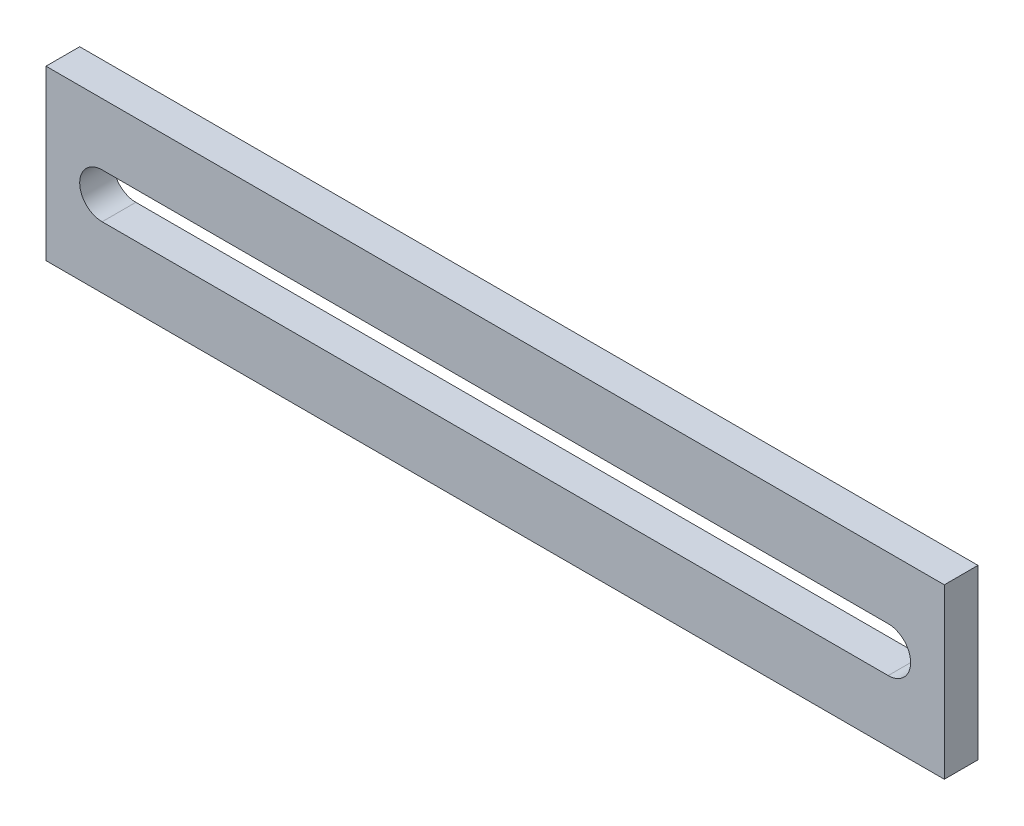
ISO-10303-21;
HEADER;
FILE_DESCRIPTION(('STEP AP214'),'2;1');
FILE_NAME('part.step','',(''),(''),'','','');
FILE_SCHEMA(('AUTOMOTIVE_DESIGN { 1 0 10303 214 1 1 1 1 }'));
ENDSEC;
DATA;
#1=APPLICATION_CONTEXT('core data for automotive mechanical design processes');
#2=APPLICATION_PROTOCOL_DEFINITION('international standard','automotive_design',2000,#1);
#3=PRODUCT_CONTEXT('',#1,'mechanical');
#4=PRODUCT('Part','Part','',(#3));
#5=PRODUCT_RELATED_PRODUCT_CATEGORY('part','',(#4));
#6=PRODUCT_DEFINITION_FORMATION('','',#4);
#7=PRODUCT_DEFINITION_CONTEXT('part definition',#1,'design');
#8=PRODUCT_DEFINITION('design','',#6,#7);
#9=PRODUCT_DEFINITION_SHAPE('','',#8);
#10=(LENGTH_UNIT() NAMED_UNIT(*) SI_UNIT(.MILLI.,.METRE.));
#11=(NAMED_UNIT(*) PLANE_ANGLE_UNIT() SI_UNIT($,.RADIAN.));
#12=(NAMED_UNIT(*) SI_UNIT($,.STERADIAN.) SOLID_ANGLE_UNIT());
#13=UNCERTAINTY_MEASURE_WITH_UNIT(LENGTH_MEASURE(1.E-05),#10,'distance_accuracy_value','');
#14=(GEOMETRIC_REPRESENTATION_CONTEXT(3) GLOBAL_UNCERTAINTY_ASSIGNED_CONTEXT((#13)) GLOBAL_UNIT_ASSIGNED_CONTEXT((#10,
#11,#12)) REPRESENTATION_CONTEXT('',''));
#15=CARTESIAN_POINT('',(0.,0.,0.));
#16=DIRECTION('',(0.,0.,1.));
#17=DIRECTION('',(1.,0.,0.));
#18=AXIS2_PLACEMENT_3D('',#15,#16,#17);
#19=CARTESIAN_POINT('',(40.,7.5,3.));
#20=DIRECTION('',(-1.,0.,0.));
#21=DIRECTION('',(0.,0.,1.));
#22=AXIS2_PLACEMENT_3D('',#19,#20,#21);
#23=PLANE('',#22);
#24=DIRECTION('',(0.,1.,0.));
#25=VECTOR('',#24,1.);
#26=CARTESIAN_POINT('',(40.,7.5,0.));
#27=LINE('',#26,#25);
#28=CARTESIAN_POINT('',(40.,-7.5,0.));
#29=VERTEX_POINT('',#28);
#30=CARTESIAN_POINT('',(40.,7.5,0.));
#31=VERTEX_POINT('',#30);
#32=EDGE_CURVE('E131',#29,#31,#27,.T.);
#33=ORIENTED_EDGE('',*,*,#32,.T.);
#34=DIRECTION('',(0.,0.,-1.));
#35=VECTOR('',#34,1.);
#36=CARTESIAN_POINT('',(40.,7.5,3.));
#37=LINE('',#36,#35);
#38=CARTESIAN_POINT('',(40.,7.5,3.));
#39=VERTEX_POINT('',#38);
#40=EDGE_CURVE('E11',#39,#31,#37,.T.);
#41=ORIENTED_EDGE('',*,*,#40,.F.);
#42=DIRECTION('',(0.,1.,0.));
#43=VECTOR('',#42,1.);
#44=CARTESIAN_POINT('',(40.,7.5,3.));
#45=LINE('',#44,#43);
#46=CARTESIAN_POINT('',(40.,-7.5,3.));
#47=VERTEX_POINT('',#46);
#48=EDGE_CURVE('E135',#47,#39,#45,.T.);
#49=ORIENTED_EDGE('',*,*,#48,.F.);
#50=DIRECTION('',(0.,0.,-1.));
#51=VECTOR('',#50,1.);
#52=CARTESIAN_POINT('',(40.,-7.5,3.));
#53=LINE('',#52,#51);
#54=EDGE_CURVE('E145',#47,#29,#53,.T.);
#55=ORIENTED_EDGE('',*,*,#54,.T.);
#56=EDGE_LOOP('',(#33,#41,#49,#55));
#57=FACE_BOUND('',#56,.T.);
#58=ADVANCED_FACE('F34',(#57),#23,.F.);
#59=CARTESIAN_POINT('',(-40.,7.5,3.));
#60=DIRECTION('',(0.,-1.,0.));
#61=DIRECTION('',(0.,0.,-1.));
#62=AXIS2_PLACEMENT_3D('',#59,#60,#61);
#63=PLANE('',#62);
#64=DIRECTION('',(-1.,0.,0.));
#65=VECTOR('',#64,1.);
#66=CARTESIAN_POINT('',(-40.,7.5,0.));
#67=LINE('',#66,#65);
#68=CARTESIAN_POINT('',(-40.,7.5,0.));
#69=VERTEX_POINT('',#68);
#70=EDGE_CURVE('E148',#31,#69,#67,.T.);
#71=ORIENTED_EDGE('',*,*,#70,.T.);
#72=DIRECTION('',(0.,0.,-1.));
#73=VECTOR('',#72,1.);
#74=CARTESIAN_POINT('',(-40.,7.5,3.));
#75=LINE('',#74,#73);
#76=CARTESIAN_POINT('',(-40.,7.5,3.));
#77=VERTEX_POINT('',#76);
#78=EDGE_CURVE('E41',#77,#69,#75,.T.);
#79=ORIENTED_EDGE('',*,*,#78,.F.);
#80=DIRECTION('',(-1.,0.,0.));
#81=VECTOR('',#80,1.);
#82=CARTESIAN_POINT('',(-40.,7.5,3.));
#83=LINE('',#82,#81);
#84=EDGE_CURVE('E138',#39,#77,#83,.T.);
#85=ORIENTED_EDGE('',*,*,#84,.F.);
#86=ORIENTED_EDGE('',*,*,#40,.T.);
#87=EDGE_LOOP('',(#71,#79,#85,#86));
#88=FACE_BOUND('',#87,.T.);
#89=ADVANCED_FACE('F176',(#88),#63,.F.);
#90=CARTESIAN_POINT('',(-40.,7.5,3.));
#91=DIRECTION('',(1.,0.,0.));
#92=DIRECTION('',(0.,0.,-1.));
#93=AXIS2_PLACEMENT_3D('',#90,#91,#92);
#94=PLANE('',#93);
#95=DIRECTION('',(0.,-1.,0.));
#96=VECTOR('',#95,1.);
#97=CARTESIAN_POINT('',(-40.,7.5,0.));
#98=LINE('',#97,#96);
#99=CARTESIAN_POINT('',(-40.,-7.5,0.));
#100=VERTEX_POINT('',#99);
#101=EDGE_CURVE('E150',#69,#100,#98,.T.);
#102=ORIENTED_EDGE('',*,*,#101,.T.);
#103=DIRECTION('',(0.,0.,-1.));
#104=VECTOR('',#103,1.);
#105=CARTESIAN_POINT('',(-40.,-7.5,3.));
#106=LINE('',#105,#104);
#107=CARTESIAN_POINT('',(-40.,-7.5,3.));
#108=VERTEX_POINT('',#107);
#109=EDGE_CURVE('E155',#108,#100,#106,.T.);
#110=ORIENTED_EDGE('',*,*,#109,.F.);
#111=DIRECTION('',(0.,-1.,0.));
#112=VECTOR('',#111,1.);
#113=CARTESIAN_POINT('',(-40.,7.5,3.));
#114=LINE('',#113,#112);
#115=EDGE_CURVE('E141',#77,#108,#114,.T.);
#116=ORIENTED_EDGE('',*,*,#115,.F.);
#117=ORIENTED_EDGE('',*,*,#78,.T.);
#118=EDGE_LOOP('',(#102,#110,#116,#117));
#119=FACE_BOUND('',#118,.T.);
#120=ADVANCED_FACE('F162',(#119),#94,.F.);
#121=CARTESIAN_POINT('',(-40.,-7.5,3.));
#122=DIRECTION('',(0.,1.,0.));
#123=DIRECTION('',(0.,0.,1.));
#124=AXIS2_PLACEMENT_3D('',#121,#122,#123);
#125=PLANE('',#124);
#126=DIRECTION('',(1.,0.,0.));
#127=VECTOR('',#126,1.);
#128=CARTESIAN_POINT('',(-40.,-7.5,0.));
#129=LINE('',#128,#127);
#130=EDGE_CURVE('E139',#100,#29,#129,.T.);
#131=ORIENTED_EDGE('',*,*,#130,.T.);
#132=ORIENTED_EDGE('',*,*,#54,.F.);
#133=DIRECTION('',(1.,0.,0.));
#134=VECTOR('',#133,1.);
#135=CARTESIAN_POINT('',(-40.,-7.5,3.));
#136=LINE('',#135,#134);
#137=EDGE_CURVE('E143',#108,#47,#136,.T.);
#138=ORIENTED_EDGE('',*,*,#137,.F.);
#139=ORIENTED_EDGE('',*,*,#109,.T.);
#140=EDGE_LOOP('',(#131,#132,#138,#139));
#141=FACE_BOUND('',#140,.T.);
#142=ADVANCED_FACE('F169',(#141),#125,.F.);
#143=CARTESIAN_POINT('',(0.,0.,3.));
#144=DIRECTION('',(0.,0.,1.));
#145=DIRECTION('',(1.,0.,0.));
#146=AXIS2_PLACEMENT_3D('',#143,#144,#145);
#147=PLANE('',#146);
#148=CARTESIAN_POINT('',(-35.,0.,3.));
#149=DIRECTION('',(0.,0.,1.));
#150=DIRECTION('',(1.,0.,0.));
#151=AXIS2_PLACEMENT_3D('',#148,#149,#150);
#152=CIRCLE('',#151,2.);
#153=CARTESIAN_POINT('',(-35.,2.,3.));
#154=VERTEX_POINT('',#153);
#155=CARTESIAN_POINT('',(-35.,-2.,3.));
#156=VERTEX_POINT('',#155);
#157=EDGE_CURVE('E48',#154,#156,#152,.T.);
#158=ORIENTED_EDGE('',*,*,#157,.F.);
#159=DIRECTION('',(-1.,0.,0.));
#160=VECTOR('',#159,1.);
#161=CARTESIAN_POINT('',(-35.,2.,3.));
#162=LINE('',#161,#160);
#163=CARTESIAN_POINT('',(35.,2.,3.));
#164=VERTEX_POINT('',#163);
#165=EDGE_CURVE('E116',#164,#154,#162,.T.);
#166=ORIENTED_EDGE('',*,*,#165,.F.);
#167=CARTESIAN_POINT('',(35.,0.,3.));
#168=DIRECTION('',(0.,0.,1.));
#169=DIRECTION('',(1.,0.,0.));
#170=AXIS2_PLACEMENT_3D('',#167,#168,#169);
#171=CIRCLE('',#170,2.);
#172=CARTESIAN_POINT('',(35.,-2.,3.));
#173=VERTEX_POINT('',#172);
#174=EDGE_CURVE('E119',#173,#164,#171,.T.);
#175=ORIENTED_EDGE('',*,*,#174,.F.);
#176=DIRECTION('',(1.,0.,0.));
#177=VECTOR('',#176,1.);
#178=CARTESIAN_POINT('',(-35.,-2.,3.));
#179=LINE('',#178,#177);
#180=EDGE_CURVE('E125',#156,#173,#179,.T.);
#181=ORIENTED_EDGE('',*,*,#180,.F.);
#182=EDGE_LOOP('',(#158,#166,#175,#181));
#183=FACE_BOUND('',#182,.T.);
#184=ORIENTED_EDGE('',*,*,#48,.T.);
#185=ORIENTED_EDGE('',*,*,#84,.T.);
#186=ORIENTED_EDGE('',*,*,#115,.T.);
#187=ORIENTED_EDGE('',*,*,#137,.T.);
#188=EDGE_LOOP('',(#184,#185,#186,#187));
#189=FACE_BOUND('',#188,.T.);
#190=ADVANCED_FACE('F175',(#183,#189),#147,.T.);
#191=CARTESIAN_POINT('',(0.,0.,0.));
#192=DIRECTION('',(0.,0.,1.));
#193=DIRECTION('',(1.,0.,0.));
#194=AXIS2_PLACEMENT_3D('',#191,#192,#193);
#195=PLANE('',#194);
#196=DIRECTION('',(-1.,0.,0.));
#197=VECTOR('',#196,1.);
#198=CARTESIAN_POINT('',(-35.,2.,0.));
#199=LINE('',#198,#197);
#200=CARTESIAN_POINT('',(35.,2.,0.));
#201=VERTEX_POINT('',#200);
#202=CARTESIAN_POINT('',(-35.,2.,0.));
#203=VERTEX_POINT('',#202);
#204=EDGE_CURVE('E106',#201,#203,#199,.T.);
#205=ORIENTED_EDGE('',*,*,#204,.T.);
#206=CARTESIAN_POINT('',(-35.,0.,0.));
#207=DIRECTION('',(0.,0.,1.));
#208=DIRECTION('',(1.,0.,0.));
#209=AXIS2_PLACEMENT_3D('',#206,#207,#208);
#210=CIRCLE('',#209,2.);
#211=CARTESIAN_POINT('',(-35.,-2.,0.));
#212=VERTEX_POINT('',#211);
#213=EDGE_CURVE('E100',#203,#212,#210,.T.);
#214=ORIENTED_EDGE('',*,*,#213,.T.);
#215=DIRECTION('',(1.,0.,0.));
#216=VECTOR('',#215,1.);
#217=CARTESIAN_POINT('',(-35.,-2.,0.));
#218=LINE('',#217,#216);
#219=CARTESIAN_POINT('',(35.,-2.,0.));
#220=VERTEX_POINT('',#219);
#221=EDGE_CURVE('E109',#212,#220,#218,.T.);
#222=ORIENTED_EDGE('',*,*,#221,.T.);
#223=CARTESIAN_POINT('',(35.,0.,0.));
#224=DIRECTION('',(0.,0.,1.));
#225=DIRECTION('',(1.,0.,0.));
#226=AXIS2_PLACEMENT_3D('',#223,#224,#225);
#227=CIRCLE('',#226,2.);
#228=EDGE_CURVE('E56',#220,#201,#227,.T.);
#229=ORIENTED_EDGE('',*,*,#228,.T.);
#230=EDGE_LOOP('',(#205,#214,#222,#229));
#231=FACE_BOUND('',#230,.T.);
#232=ORIENTED_EDGE('',*,*,#32,.F.);
#233=ORIENTED_EDGE('',*,*,#130,.F.);
#234=ORIENTED_EDGE('',*,*,#101,.F.);
#235=ORIENTED_EDGE('',*,*,#70,.F.);
#236=EDGE_LOOP('',(#232,#233,#234,#235));
#237=FACE_BOUND('',#236,.T.);
#238=ADVANCED_FACE('F113',(#231,#237),#195,.F.);
#239=CARTESIAN_POINT('',(-35.,0.,0.));
#240=DIRECTION('',(0.,0.,1.));
#241=DIRECTION('',(1.,0.,0.));
#242=AXIS2_PLACEMENT_3D('',#239,#240,#241);
#243=CYLINDRICAL_SURFACE('',#242,2.);
#244=ORIENTED_EDGE('',*,*,#157,.T.);
#245=DIRECTION('',(0.,0.,1.));
#246=VECTOR('',#245,1.);
#247=CARTESIAN_POINT('',(-35.,-2.,0.));
#248=LINE('',#247,#246);
#249=EDGE_CURVE('E96',#212,#156,#248,.T.);
#250=ORIENTED_EDGE('',*,*,#249,.F.);
#251=ORIENTED_EDGE('',*,*,#213,.F.);
#252=DIRECTION('',(0.,0.,1.));
#253=VECTOR('',#252,1.);
#254=CARTESIAN_POINT('',(-35.,2.,0.));
#255=LINE('',#254,#253);
#256=EDGE_CURVE('E129',#203,#154,#255,.T.);
#257=ORIENTED_EDGE('',*,*,#256,.T.);
#258=EDGE_LOOP('',(#244,#250,#251,#257));
#259=FACE_BOUND('',#258,.T.);
#260=ADVANCED_FACE('F98',(#259),#243,.F.);
#261=CARTESIAN_POINT('',(-35.,2.,0.));
#262=DIRECTION('',(0.,1.,0.));
#263=DIRECTION('',(0.,0.,1.));
#264=AXIS2_PLACEMENT_3D('',#261,#262,#263);
#265=PLANE('',#264);
#266=ORIENTED_EDGE('',*,*,#165,.T.);
#267=ORIENTED_EDGE('',*,*,#256,.F.);
#268=ORIENTED_EDGE('',*,*,#204,.F.);
#269=DIRECTION('',(0.,0.,1.));
#270=VECTOR('',#269,1.);
#271=CARTESIAN_POINT('',(35.,2.,0.));
#272=LINE('',#271,#270);
#273=EDGE_CURVE('E132',#201,#164,#272,.T.);
#274=ORIENTED_EDGE('',*,*,#273,.T.);
#275=EDGE_LOOP('',(#266,#267,#268,#274));
#276=FACE_BOUND('',#275,.T.);
#277=ADVANCED_FACE('F193',(#276),#265,.F.);
#278=CARTESIAN_POINT('',(35.,0.,0.));
#279=DIRECTION('',(0.,0.,1.));
#280=DIRECTION('',(1.,0.,0.));
#281=AXIS2_PLACEMENT_3D('',#278,#279,#280);
#282=CYLINDRICAL_SURFACE('',#281,2.);
#283=ORIENTED_EDGE('',*,*,#174,.T.);
#284=ORIENTED_EDGE('',*,*,#273,.F.);
#285=ORIENTED_EDGE('',*,*,#228,.F.);
#286=DIRECTION('',(0.,0.,1.));
#287=VECTOR('',#286,1.);
#288=CARTESIAN_POINT('',(35.,-2.,0.));
#289=LINE('',#288,#287);
#290=EDGE_CURVE('E105',#220,#173,#289,.T.);
#291=ORIENTED_EDGE('',*,*,#290,.T.);
#292=EDGE_LOOP('',(#283,#284,#285,#291));
#293=FACE_BOUND('',#292,.T.);
#294=ADVANCED_FACE('F196',(#293),#282,.F.);
#295=CARTESIAN_POINT('',(-35.,-2.,0.));
#296=DIRECTION('',(0.,-1.,0.));
#297=DIRECTION('',(0.,0.,-1.));
#298=AXIS2_PLACEMENT_3D('',#295,#296,#297);
#299=PLANE('',#298);
#300=ORIENTED_EDGE('',*,*,#180,.T.);
#301=ORIENTED_EDGE('',*,*,#290,.F.);
#302=ORIENTED_EDGE('',*,*,#221,.F.);
#303=ORIENTED_EDGE('',*,*,#249,.T.);
#304=EDGE_LOOP('',(#300,#301,#302,#303));
#305=FACE_BOUND('',#304,.T.);
#306=ADVANCED_FACE('F110',(#305),#299,.F.);
#307=CLOSED_SHELL('',(#58,#89,#120,#142,#190,#238,#260,#277,#294,#306));
#308=MANIFOLD_SOLID_BREP('B2',#307);
#309=ADVANCED_BREP_SHAPE_REPRESENTATION('',(#18,#308),#14);
#310=SHAPE_DEFINITION_REPRESENTATION(#9,#309);
ENDSEC;
END-ISO-10303-21;
